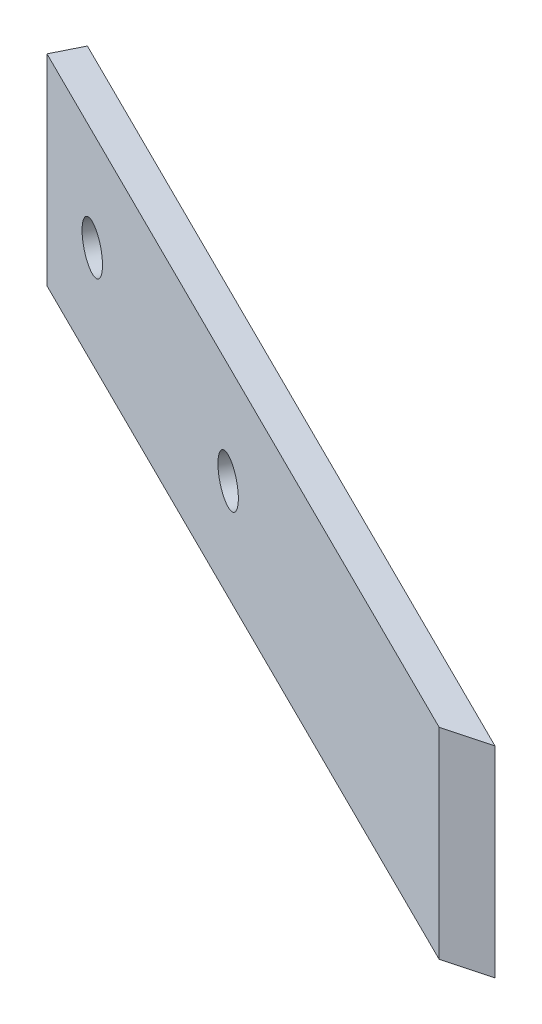
ISO-10303-21;
HEADER;
FILE_DESCRIPTION(('STEP AP214'),'2;1');
FILE_NAME('part.step','',(''),(''),'','','');
FILE_SCHEMA(('AUTOMOTIVE_DESIGN { 1 0 10303 214 1 1 1 1 }'));
ENDSEC;
DATA;
#1=APPLICATION_CONTEXT('core data for automotive mechanical design processes');
#2=APPLICATION_PROTOCOL_DEFINITION('international standard','automotive_design',2000,#1);
#3=PRODUCT_CONTEXT('',#1,'mechanical');
#4=PRODUCT('Part','Part','',(#3));
#5=PRODUCT_RELATED_PRODUCT_CATEGORY('part','',(#4));
#6=PRODUCT_DEFINITION_FORMATION('','',#4);
#7=PRODUCT_DEFINITION_CONTEXT('part definition',#1,'design');
#8=PRODUCT_DEFINITION('design','',#6,#7);
#9=PRODUCT_DEFINITION_SHAPE('','',#8);
#10=(LENGTH_UNIT() NAMED_UNIT(*) SI_UNIT(.MILLI.,.METRE.));
#11=(NAMED_UNIT(*) PLANE_ANGLE_UNIT() SI_UNIT($,.RADIAN.));
#12=(NAMED_UNIT(*) SI_UNIT($,.STERADIAN.) SOLID_ANGLE_UNIT());
#13=UNCERTAINTY_MEASURE_WITH_UNIT(LENGTH_MEASURE(1.E-05),#10,'distance_accuracy_value','');
#14=(GEOMETRIC_REPRESENTATION_CONTEXT(3) GLOBAL_UNCERTAINTY_ASSIGNED_CONTEXT((#13)) GLOBAL_UNIT_ASSIGNED_CONTEXT((#10,
#11,#12)) REPRESENTATION_CONTEXT('',''));
#15=CARTESIAN_POINT('',(0.,0.,0.));
#16=DIRECTION('',(0.,0.,1.));
#17=DIRECTION('',(1.,0.,0.));
#18=AXIS2_PLACEMENT_3D('',#15,#16,#17);
#19=CARTESIAN_POINT('',(810.48588506093,2000.,2282.549542086));
#20=DIRECTION('',(0.444888355651126,0.,-0.895586037746255));
#21=DIRECTION('',(0.895586037746255,0.,0.444888355651126));
#22=AXIS2_PLACEMENT_3D('',#19,#20,#21);
#23=CYLINDRICAL_SURFACE('',#22,4.5);
#24=CARTESIAN_POINT('',(810.44139622537,2000.,2282.63910069));
#25=DIRECTION('',(0.444888355651126,0.,-0.895586037746255));
#26=DIRECTION('',(0.895586037746255,0.,0.444888355651126));
#27=AXIS2_PLACEMENT_3D('',#24,#25,#26);
#28=CIRCLE('',#27,4.5);
#29=CARTESIAN_POINT('',(814.47153339522,2000.,2284.641098291));
#30=VERTEX_POINT('',#29);
#31=EDGE_CURVE('E138',#30,#30,#28,.T.);
#32=ORIENTED_EDGE('',*,*,#31,.T.);
#33=DIRECTION('',(-0.444888355651126,0.,0.895586037746255));
#34=VECTOR('',#33,1.);
#35=CARTESIAN_POINT('',(814.51602223079,2000.,2284.551539687));
#36=LINE('',#35,#34);
#37=CARTESIAN_POINT('',(811.80220326132,2000.,2290.014614517));
#38=VERTEX_POINT('',#37);
#39=EDGE_CURVE('E11',#30,#38,#36,.T.);
#40=ORIENTED_EDGE('',*,*,#39,.T.);
#41=CARTESIAN_POINT('',(807.77206609146,2000.,2288.012616917));
#42=DIRECTION('',(0.444888355651126,0.,-0.895586037746255));
#43=DIRECTION('',(0.895586037746255,0.,0.444888355651126));
#44=AXIS2_PLACEMENT_3D('',#41,#42,#43);
#45=CIRCLE('',#44,4.5);
#46=EDGE_CURVE('E145',#38,#38,#45,.T.);
#47=ORIENTED_EDGE('',*,*,#46,.F.);
#48=ORIENTED_EDGE('',*,*,#39,.F.);
#49=EDGE_LOOP('',(#32,#40,#47,#48));
#50=FACE_BOUND('',#49,.T.);
#51=ADVANCED_FACE('F17',(#50),#23,.F.);
#52=CARTESIAN_POINT('',(756.75072279615,2000.,2255.856240747));
#53=DIRECTION('',(0.444888355651126,0.,-0.895586037746255));
#54=DIRECTION('',(0.895586037746255,0.,0.444888355651126));
#55=AXIS2_PLACEMENT_3D('',#52,#53,#54);
#56=CYLINDRICAL_SURFACE('',#55,4.5);
#57=CARTESIAN_POINT('',(756.70623396059,2000.,2255.945799351));
#58=DIRECTION('',(0.444888355651126,0.,-0.895586037746255));
#59=DIRECTION('',(0.895586037746255,0.,0.444888355651126));
#60=AXIS2_PLACEMENT_3D('',#57,#58,#59);
#61=CIRCLE('',#60,4.5);
#62=CARTESIAN_POINT('',(760.73637113045,2000.,2257.947796952));
#63=VERTEX_POINT('',#62);
#64=EDGE_CURVE('E153',#63,#63,#61,.T.);
#65=ORIENTED_EDGE('',*,*,#64,.T.);
#66=DIRECTION('',(-0.444888355651126,0.,0.895586037746255));
#67=VECTOR('',#66,1.);
#68=CARTESIAN_POINT('',(760.78085996601,2000.,2257.858238348));
#69=LINE('',#68,#67);
#70=CARTESIAN_POINT('',(758.06704099654,2000.,2263.321313178));
#71=VERTEX_POINT('',#70);
#72=EDGE_CURVE('E26',#63,#71,#69,.T.);
#73=ORIENTED_EDGE('',*,*,#72,.T.);
#74=CARTESIAN_POINT('',(754.03690382668,2000.,2261.319315578));
#75=DIRECTION('',(0.444888355651126,0.,-0.895586037746255));
#76=DIRECTION('',(0.895586037746255,0.,0.444888355651126));
#77=AXIS2_PLACEMENT_3D('',#74,#75,#76);
#78=CIRCLE('',#77,4.5);
#79=EDGE_CURVE('E142',#71,#71,#78,.T.);
#80=ORIENTED_EDGE('',*,*,#79,.F.);
#81=ORIENTED_EDGE('',*,*,#72,.F.);
#82=EDGE_LOOP('',(#65,#73,#80,#81));
#83=FACE_BOUND('',#82,.T.);
#84=ADVANCED_FACE('F164',(#83),#56,.F.);
#85=CARTESIAN_POINT('',(-46.716837641,0.,2580.799948362));
#86=DIRECTION('',(-0.258819045102985,0.,-0.965925826288944));
#87=DIRECTION('',(-0.965925826288944,0.,0.258819045102985));
#88=AXIS2_PLACEMENT_3D('',#85,#86,#87);
#89=PLANE('',#88);
#90=DIRECTION('',(0.,-1.,0.));
#91=VECTOR('',#90,1.);
#92=CARTESIAN_POINT('',(891.23908422478,990.,2329.475416562));
#93=LINE('',#92,#91);
#94=CARTESIAN_POINT('',(891.23908422478,2020.,2329.475416562));
#95=VERTEX_POINT('',#94);
#96=CARTESIAN_POINT('',(891.23908422478,1980.,2329.475416562));
#97=VERTEX_POINT('',#96);
#98=EDGE_CURVE('E99',#95,#97,#93,.T.);
#99=ORIENTED_EDGE('',*,*,#98,.T.);
#100=DIRECTION('',(-0.965925826288944,0.,0.258819045102985));
#101=VECTOR('',#100,1.);
#102=CARTESIAN_POINT('',(361.44818578473,1980.,2471.432459957));
#103=LINE('',#102,#101);
#104=CARTESIAN_POINT('',(900.,1980.,2327.127936255));
#105=VERTEX_POINT('',#104);
#106=EDGE_CURVE('E103',#105,#97,#103,.T.);
#107=ORIENTED_EDGE('',*,*,#106,.F.);
#108=DIRECTION('',(0.,1.,0.));
#109=VECTOR('',#108,1.);
#110=CARTESIAN_POINT('',(900.,1980.,2327.127936255));
#111=LINE('',#110,#109);
#112=CARTESIAN_POINT('',(900.,2020.,2327.127936255));
#113=VERTEX_POINT('',#112);
#114=EDGE_CURVE('E74',#105,#113,#111,.T.);
#115=ORIENTED_EDGE('',*,*,#114,.T.);
#116=DIRECTION('',(-0.965925826288944,0.,0.258819045102985));
#117=VECTOR('',#116,1.);
#118=CARTESIAN_POINT('',(361.44818578473,2020.,2471.432459957));
#119=LINE('',#118,#117);
#120=EDGE_CURVE('E148',#113,#95,#119,.T.);
#121=ORIENTED_EDGE('',*,*,#120,.T.);
#122=EDGE_LOOP('',(#99,#107,#115,#121));
#123=FACE_BOUND('',#122,.T.);
#124=ADVANCED_FACE('F169',(#123),#89,.F.);
#125=CARTESIAN_POINT('',(738.79451320566,1980.,2247.048032238));
#126=DIRECTION('',(-0.444888355651126,0.,0.895586037746255));
#127=DIRECTION('',(0.,1.,0.));
#128=AXIS2_PLACEMENT_3D('',#125,#126,#127);
#129=PLANE('',#128);
#130=ORIENTED_EDGE('',*,*,#31,.F.);
#131=EDGE_LOOP('',(#130));
#132=FACE_BOUND('',#131,.T.);
#133=ORIENTED_EDGE('',*,*,#64,.F.);
#134=EDGE_LOOP('',(#133));
#135=FACE_BOUND('',#134,.T.);
#136=DIRECTION('',(0.895586037746255,0.,0.444888355651126));
#137=VECTOR('',#136,1.);
#138=CARTESIAN_POINT('',(738.79451320566,2020.,2247.048032238));
#139=LINE('',#138,#137);
#140=CARTESIAN_POINT('',(738.79451320566,2020.,2247.048032238));
#141=VERTEX_POINT('',#140);
#142=EDGE_CURVE('E108',#141,#113,#139,.T.);
#143=ORIENTED_EDGE('',*,*,#142,.T.);
#144=ORIENTED_EDGE('',*,*,#114,.F.);
#145=DIRECTION('',(0.895586037746255,0.,0.444888355651126));
#146=VECTOR('',#145,1.);
#147=CARTESIAN_POINT('',(738.79451320566,1980.,2247.048032238));
#148=LINE('',#147,#146);
#149=CARTESIAN_POINT('',(738.79451320566,1980.,2247.048032238));
#150=VERTEX_POINT('',#149);
#151=EDGE_CURVE('E126',#150,#105,#148,.T.);
#152=ORIENTED_EDGE('',*,*,#151,.F.);
#153=DIRECTION('',(0.,1.,0.));
#154=VECTOR('',#153,1.);
#155=CARTESIAN_POINT('',(738.79451320566,1980.,2247.048032238));
#156=LINE('',#155,#154);
#157=EDGE_CURVE('E113',#150,#141,#156,.T.);
#158=ORIENTED_EDGE('',*,*,#157,.T.);
#159=EDGE_LOOP('',(#143,#144,#152,#158));
#160=FACE_BOUND('',#159,.T.);
#161=ADVANCED_FACE('F200',(#132,#135,#160),#129,.F.);
#162=CARTESIAN_POINT('',(738.79451320566,2020.,2247.048032238));
#163=DIRECTION('',(0.,1.,0.));
#164=DIRECTION('',(1.,0.,0.));
#165=AXIS2_PLACEMENT_3D('',#162,#163,#164);
#166=PLANE('',#165);
#167=ORIENTED_EDGE('',*,*,#120,.F.);
#168=ORIENTED_EDGE('',*,*,#142,.F.);
#169=DIRECTION('',(-0.444888355651126,0.,0.895586037746255));
#170=VECTOR('',#169,1.);
#171=CARTESIAN_POINT('',(738.79451320566,2020.,2247.048032238));
#172=LINE('',#171,#170);
#173=CARTESIAN_POINT('',(736.12518307176,2020.,2252.421548465));
#174=VERTEX_POINT('',#173);
#175=EDGE_CURVE('E106',#141,#174,#172,.T.);
#176=ORIENTED_EDGE('',*,*,#175,.T.);
#177=DIRECTION('',(0.895586037746255,0.,0.444888355651126));
#178=VECTOR('',#177,1.);
#179=CARTESIAN_POINT('',(736.12518307176,2020.,2252.421548465));
#180=LINE('',#179,#178);
#181=EDGE_CURVE('E93',#174,#95,#180,.T.);
#182=ORIENTED_EDGE('',*,*,#181,.T.);
#183=EDGE_LOOP('',(#167,#168,#176,#182));
#184=FACE_BOUND('',#183,.T.);
#185=ADVANCED_FACE('F107',(#184),#166,.T.);
#186=CARTESIAN_POINT('',(736.12518307176,1980.,2252.421548465));
#187=DIRECTION('',(-0.444888355651126,0.,0.895586037746255));
#188=DIRECTION('',(0.,1.,0.));
#189=AXIS2_PLACEMENT_3D('',#186,#187,#188);
#190=PLANE('',#189);
#191=ORIENTED_EDGE('',*,*,#46,.T.);
#192=EDGE_LOOP('',(#191));
#193=FACE_BOUND('',#192,.T.);
#194=ORIENTED_EDGE('',*,*,#79,.T.);
#195=EDGE_LOOP('',(#194));
#196=FACE_BOUND('',#195,.T.);
#197=ORIENTED_EDGE('',*,*,#181,.F.);
#198=DIRECTION('',(0.,1.,0.));
#199=VECTOR('',#198,1.);
#200=CARTESIAN_POINT('',(736.12518307176,1980.,2252.421548465));
#201=LINE('',#200,#199);
#202=CARTESIAN_POINT('',(736.12518307176,1980.,2252.421548465));
#203=VERTEX_POINT('',#202);
#204=EDGE_CURVE('E98',#203,#174,#201,.T.);
#205=ORIENTED_EDGE('',*,*,#204,.F.);
#206=DIRECTION('',(0.895586037746255,0.,0.444888355651126));
#207=VECTOR('',#206,1.);
#208=CARTESIAN_POINT('',(736.12518307176,1980.,2252.421548465));
#209=LINE('',#208,#207);
#210=EDGE_CURVE('E131',#203,#97,#209,.T.);
#211=ORIENTED_EDGE('',*,*,#210,.T.);
#212=ORIENTED_EDGE('',*,*,#98,.F.);
#213=EDGE_LOOP('',(#197,#205,#211,#212));
#214=FACE_BOUND('',#213,.T.);
#215=ADVANCED_FACE('F95',(#193,#196,#214),#190,.T.);
#216=CARTESIAN_POINT('',(738.79451320566,1980.,2247.048032238));
#217=DIRECTION('',(0.,1.,0.));
#218=DIRECTION('',(1.,0.,0.));
#219=AXIS2_PLACEMENT_3D('',#216,#217,#218);
#220=PLANE('',#219);
#221=ORIENTED_EDGE('',*,*,#210,.F.);
#222=DIRECTION('',(-0.444888355651126,0.,0.895586037746255));
#223=VECTOR('',#222,1.);
#224=CARTESIAN_POINT('',(738.79451320566,1980.,2247.048032238));
#225=LINE('',#224,#223);
#226=EDGE_CURVE('E118',#150,#203,#225,.T.);
#227=ORIENTED_EDGE('',*,*,#226,.F.);
#228=ORIENTED_EDGE('',*,*,#151,.T.);
#229=ORIENTED_EDGE('',*,*,#106,.T.);
#230=EDGE_LOOP('',(#221,#227,#228,#229));
#231=FACE_BOUND('',#230,.T.);
#232=ADVANCED_FACE('F179',(#231),#220,.F.);
#233=CARTESIAN_POINT('',(738.79451320566,1980.,2247.048032238));
#234=DIRECTION('',(0.895586037746255,0.,0.444888355651126));
#235=DIRECTION('',(0.,-1.,0.));
#236=AXIS2_PLACEMENT_3D('',#233,#234,#235);
#237=PLANE('',#236);
#238=ORIENTED_EDGE('',*,*,#204,.T.);
#239=ORIENTED_EDGE('',*,*,#175,.F.);
#240=ORIENTED_EDGE('',*,*,#157,.F.);
#241=ORIENTED_EDGE('',*,*,#226,.T.);
#242=EDGE_LOOP('',(#238,#239,#240,#241));
#243=FACE_BOUND('',#242,.T.);
#244=ADVANCED_FACE('F116',(#243),#237,.F.);
#245=CLOSED_SHELL('',(#51,#84,#124,#161,#185,#215,#232,#244));
#246=MANIFOLD_SOLID_BREP('B1',#245);
#247=ADVANCED_BREP_SHAPE_REPRESENTATION('',(#18,#246),#14);
#248=SHAPE_DEFINITION_REPRESENTATION(#9,#247);
ENDSEC;
END-ISO-10303-21;
